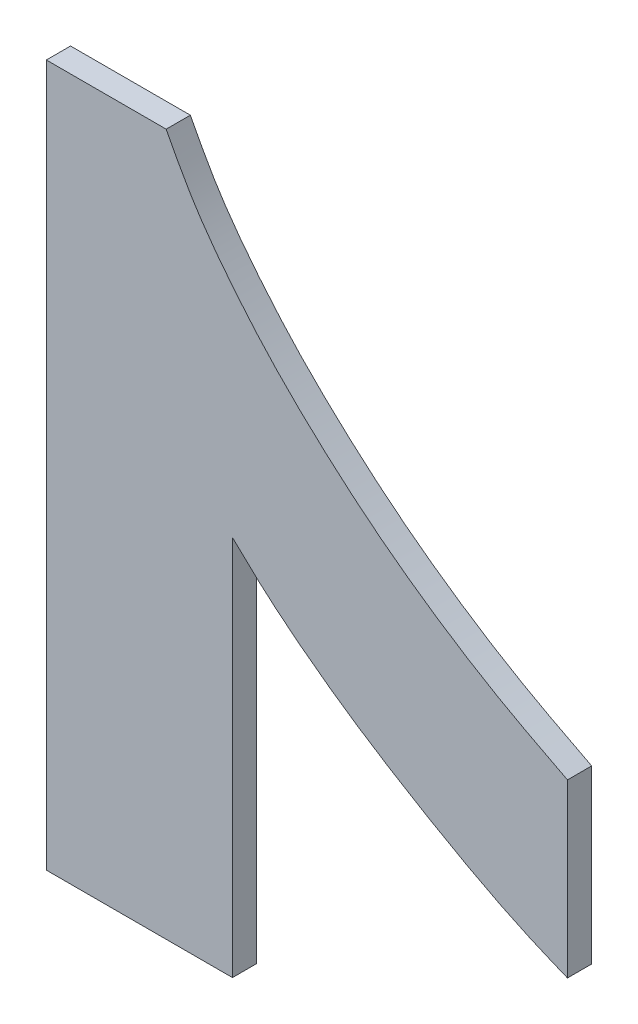
ISO-10303-21;
HEADER;
FILE_DESCRIPTION(('STEP AP214'),'2;1');
FILE_NAME('part.step','',(''),(''),'','','');
FILE_SCHEMA(('AUTOMOTIVE_DESIGN { 1 0 10303 214 1 1 1 1 }'));
ENDSEC;
DATA;
#1=APPLICATION_CONTEXT('core data for automotive mechanical design processes');
#2=APPLICATION_PROTOCOL_DEFINITION('international standard','automotive_design',2000,#1);
#3=PRODUCT_CONTEXT('',#1,'mechanical');
#4=PRODUCT('Part','Part','',(#3));
#5=PRODUCT_RELATED_PRODUCT_CATEGORY('part','',(#4));
#6=PRODUCT_DEFINITION_FORMATION('','',#4);
#7=PRODUCT_DEFINITION_CONTEXT('part definition',#1,'design');
#8=PRODUCT_DEFINITION('design','',#6,#7);
#9=PRODUCT_DEFINITION_SHAPE('','',#8);
#10=(LENGTH_UNIT() NAMED_UNIT(*) SI_UNIT(.MILLI.,.METRE.));
#11=(NAMED_UNIT(*) PLANE_ANGLE_UNIT() SI_UNIT($,.RADIAN.));
#12=(NAMED_UNIT(*) SI_UNIT($,.STERADIAN.) SOLID_ANGLE_UNIT());
#13=UNCERTAINTY_MEASURE_WITH_UNIT(LENGTH_MEASURE(1.E-05),#10,'distance_accuracy_value','');
#14=(GEOMETRIC_REPRESENTATION_CONTEXT(3) GLOBAL_UNCERTAINTY_ASSIGNED_CONTEXT((#13)) GLOBAL_UNIT_ASSIGNED_CONTEXT((#10,
#11,#12)) REPRESENTATION_CONTEXT('',''));
#15=CARTESIAN_POINT('',(0.,0.,0.));
#16=DIRECTION('',(0.,0.,1.));
#17=DIRECTION('',(1.,0.,0.));
#18=AXIS2_PLACEMENT_3D('',#15,#16,#17);
#19=CARTESIAN_POINT('',(-3.84615384615383,15.,0.5));
#20=DIRECTION('',(1.,0.,0.));
#21=DIRECTION('',(0.,0.,-1.));
#22=AXIS2_PLACEMENT_3D('',#19,#20,#21);
#23=PLANE('',#22);
#24=DIRECTION('',(0.,-1.,0.));
#25=VECTOR('',#24,1.);
#26=CARTESIAN_POINT('',(-3.84615384615383,15.,0.));
#27=LINE('',#26,#25);
#28=CARTESIAN_POINT('',(-3.84615384615383,15.,0.));
#29=VERTEX_POINT('',#28);
#30=CARTESIAN_POINT('',(-3.84615384615383,0.5,0.));
#31=VERTEX_POINT('',#30);
#32=EDGE_CURVE('E117',#29,#31,#27,.T.);
#33=ORIENTED_EDGE('',*,*,#32,.T.);
#34=DIRECTION('',(0.,0.,1.));
#35=VECTOR('',#34,1.);
#36=CARTESIAN_POINT('',(-3.84615384615383,0.5,0.5));
#37=LINE('',#36,#35);
#38=CARTESIAN_POINT('',(-3.84615384615383,0.5,0.5));
#39=VERTEX_POINT('',#38);
#40=EDGE_CURVE('E53',#31,#39,#37,.T.);
#41=ORIENTED_EDGE('',*,*,#40,.T.);
#42=DIRECTION('',(0.,-1.,0.));
#43=VECTOR('',#42,1.);
#44=CARTESIAN_POINT('',(-3.84615384615383,15.,0.5));
#45=LINE('',#44,#43);
#46=CARTESIAN_POINT('',(-3.84615384615383,15.,0.5));
#47=VERTEX_POINT('',#46);
#48=EDGE_CURVE('E108',#47,#39,#45,.T.);
#49=ORIENTED_EDGE('',*,*,#48,.F.);
#50=DIRECTION('',(0.,0.,-1.));
#51=VECTOR('',#50,1.);
#52=CARTESIAN_POINT('',(-3.84615384615383,15.,0.5));
#53=LINE('',#52,#51);
#54=EDGE_CURVE('E103',#47,#29,#53,.T.);
#55=ORIENTED_EDGE('',*,*,#54,.T.);
#56=EDGE_LOOP('',(#33,#41,#49,#55));
#57=FACE_BOUND('',#56,.T.);
#58=ADVANCED_FACE('F39',(#57),#23,.F.);
#59=CARTESIAN_POINT('',(0.,-15.,0.5));
#60=DIRECTION('',(-1.,0.,0.));
#61=DIRECTION('',(0.,0.,1.));
#62=AXIS2_PLACEMENT_3D('',#59,#60,#61);
#63=PLANE('',#62);
#64=DIRECTION('',(0.,1.,0.));
#65=VECTOR('',#64,1.);
#66=CARTESIAN_POINT('',(0.,-15.,0.5));
#67=LINE('',#66,#65);
#68=CARTESIAN_POINT('',(0.,0.499999999999997,0.5));
#69=VERTEX_POINT('',#68);
#70=CARTESIAN_POINT('',(0.,8.37740384615384,0.5));
#71=VERTEX_POINT('',#70);
#72=EDGE_CURVE('E101',#69,#71,#67,.T.);
#73=ORIENTED_EDGE('',*,*,#72,.F.);
#74=DIRECTION('',(0.,0.,-1.));
#75=VECTOR('',#74,1.);
#76=CARTESIAN_POINT('',(0.,0.5,0.5));
#77=LINE('',#76,#75);
#78=CARTESIAN_POINT('',(0.,0.5,0.));
#79=VERTEX_POINT('',#78);
#80=EDGE_CURVE('E91',#69,#79,#77,.T.);
#81=ORIENTED_EDGE('',*,*,#80,.T.);
#82=DIRECTION('',(0.,1.,0.));
#83=VECTOR('',#82,1.);
#84=CARTESIAN_POINT('',(0.,-15.,0.));
#85=LINE('',#84,#83);
#86=CARTESIAN_POINT('',(0.,8.37740384615384,0.));
#87=VERTEX_POINT('',#86);
#88=EDGE_CURVE('E105',#79,#87,#85,.T.);
#89=ORIENTED_EDGE('',*,*,#88,.T.);
#90=DIRECTION('',(0.,0.,-1.));
#91=VECTOR('',#90,1.);
#92=CARTESIAN_POINT('',(0.,8.37740384615384,0.5));
#93=LINE('',#92,#91);
#94=EDGE_CURVE('E358',#71,#87,#93,.T.);
#95=ORIENTED_EDGE('',*,*,#94,.F.);
#96=EDGE_LOOP('',(#73,#81,#89,#95));
#97=FACE_BOUND('',#96,.T.);
#98=ADVANCED_FACE('F99',(#97),#63,.F.);
#99=CARTESIAN_POINT('',(3.26330198461052,5.85851248596221,0.5));
#100=DIRECTION('',(0.,0.,-1.));
#101=DIRECTION('',(-1.,0.,0.));
#102=AXIS2_PLACEMENT_3D('',#99,#100,#101);
#103=PLANE('',#102);
#104=ORIENTED_EDGE('',*,*,#48,.T.);
#105=DIRECTION('',(1.,0.,0.));
#106=VECTOR('',#105,1.);
#107=CARTESIAN_POINT('',(3.26330198461052,0.5,0.5));
#108=LINE('',#107,#106);
#109=EDGE_CURVE('E111',#39,#69,#108,.T.);
#110=ORIENTED_EDGE('',*,*,#109,.T.);
#111=ORIENTED_EDGE('',*,*,#72,.T.);
#112=CARTESIAN_POINT('',(0.,8.37740384615384,0.5));
#113=CARTESIAN_POINT('',(0.221461878749049,8.16383111101191,0.5));
#114=CARTESIAN_POINT('',(0.681746123807014,7.71994358637309,0.5));
#115=CARTESIAN_POINT('',(1.45980801498442,7.09173189610138,0.5));
#116=CARTESIAN_POINT('',(2.32822452083274,6.45501271909084,0.5));
#117=CARTESIAN_POINT('',(3.27571870044587,5.84273604838447,0.5));
#118=CARTESIAN_POINT('',(4.24152873095678,5.26634359159262,0.5));
#119=CARTESIAN_POINT('',(5.17485978081582,4.74796719190857,0.5));
#120=CARTESIAN_POINT('',(6.06012949063285,4.30929498495674,0.5));
#121=CARTESIAN_POINT('',(6.6432614298942,4.069427286743,0.5));
#122=CARTESIAN_POINT('',(6.92307692307694,3.95432692307692,0.5));
#123=B_SPLINE_CURVE_WITH_KNOTS('',3,(#112,#113,#114,#115,#116,#117,#118,#119,#120,#121,#122),
.UNSPECIFIED.,.F.,.F.,(4,1,1,1,1,1,1,1,4),(0.,0.111670300101587,0.232094480856018,
0.362743459104553,0.502557509710885,0.641525103331281,0.771098495299668,0.890161757373253,1.),.UNSPECIFIED.);
#124=CARTESIAN_POINT('',(6.92307692307694,3.95432692307692,0.5));
#125=VERTEX_POINT('',#124);
#126=EDGE_CURVE('E121',#71,#125,#123,.T.);
#127=ORIENTED_EDGE('',*,*,#126,.T.);
#128=DIRECTION('',(0.,1.,0.));
#129=VECTOR('',#128,1.);
#130=CARTESIAN_POINT('',(6.92307692307694,3.95432692307692,0.5));
#131=LINE('',#130,#129);
#132=CARTESIAN_POINT('',(6.92307692307694,7.5,0.5));
#133=VERTEX_POINT('',#132);
#134=EDGE_CURVE('E127',#125,#133,#131,.T.);
#135=ORIENTED_EDGE('',*,*,#134,.T.);
#136=CARTESIAN_POINT('',(6.92307692307694,7.5,0.5));
#137=CARTESIAN_POINT('',(6.442464896918,7.74751615567842,0.5));
#138=CARTESIAN_POINT('',(5.49520705204643,8.23535584223946,0.5));
#139=CARTESIAN_POINT('',(4.15693655137856,9.07792204430808,0.5));
#140=CARTESIAN_POINT('',(2.9075170795154,9.99129849222041,0.5));
#141=CARTESIAN_POINT('',(1.76763147520342,10.9752829641881,0.5));
#142=CARTESIAN_POINT('',(0.745796665948821,11.9810917316379,0.5));
#143=CARTESIAN_POINT('',(-0.115318366653793,12.995992285635,0.5));
#144=CARTESIAN_POINT('',(-0.835844629758691,13.9827827559656,0.5));
#145=CARTESIAN_POINT('',(-1.19734630567233,14.6709596746129,0.5));
#146=CARTESIAN_POINT('',(-1.37019230769229,15.,0.5));
#147=B_SPLINE_CURVE_WITH_KNOTS('',3,(#136,#137,#138,#139,#140,#141,#142,#143,#144,#145,#146),
.UNSPECIFIED.,.F.,.F.,(4,1,1,1,1,1,1,1,4),(0.,0.142657250700614,0.281168993905444,
0.416977192367974,0.550852492747558,0.678364170261812,0.795032443007095,0.901998178347352,1.),.UNSPECIFIED.);
#148=CARTESIAN_POINT('',(-1.37019230769229,15.,0.5));
#149=VERTEX_POINT('',#148);
#150=EDGE_CURVE('E133',#133,#149,#147,.T.);
#151=ORIENTED_EDGE('',*,*,#150,.T.);
#152=DIRECTION('',(-1.,0.,0.));
#153=VECTOR('',#152,1.);
#154=CARTESIAN_POINT('',(-1.37019230769229,15.,0.5));
#155=LINE('',#154,#153);
#156=EDGE_CURVE('E136',#149,#47,#155,.T.);
#157=ORIENTED_EDGE('',*,*,#156,.T.);
#158=EDGE_LOOP('',(#104,#110,#111,#127,#135,#151,#157));
#159=FACE_BOUND('',#158,.T.);
#160=ADVANCED_FACE('F158',(#159),#103,.F.);
#161=DIRECTION('',(0.,0.,-1.));
#162=VECTOR('',#161,1.);
#163=SURFACE_OF_LINEAR_EXTRUSION('',#123,#162);
#164=CARTESIAN_POINT('',(0.,8.37740384615384,0.));
#165=CARTESIAN_POINT('',(0.221461878749049,8.16383111101191,0.));
#166=CARTESIAN_POINT('',(0.681746123807014,7.71994358637309,0.));
#167=CARTESIAN_POINT('',(1.45980801498442,7.09173189610138,0.));
#168=CARTESIAN_POINT('',(2.32822452083274,6.45501271909084,0.));
#169=CARTESIAN_POINT('',(3.27571870044587,5.84273604838447,0.));
#170=CARTESIAN_POINT('',(4.24152873095678,5.26634359159262,0.));
#171=CARTESIAN_POINT('',(5.17485978081582,4.74796719190857,0.));
#172=CARTESIAN_POINT('',(6.06012949063285,4.30929498495674,0.));
#173=CARTESIAN_POINT('',(6.6432614298942,4.069427286743,0.));
#174=CARTESIAN_POINT('',(6.92307692307694,3.95432692307692,0.));
#175=B_SPLINE_CURVE_WITH_KNOTS('',3,(#164,#165,#166,#167,#168,#169,#170,#171,#172,#173,#174),
.UNSPECIFIED.,.F.,.F.,(4,1,1,1,1,1,1,1,4),(0.,0.111670300101587,0.232094480856018,
0.362743459104553,0.502557509710885,0.641525103331281,0.771098495299668,0.890161757373253,1.),.UNSPECIFIED.);
#176=CARTESIAN_POINT('',(6.92307692307694,3.95432692307692,0.));
#177=VERTEX_POINT('',#176);
#178=EDGE_CURVE('E106',#87,#177,#175,.T.);
#179=ORIENTED_EDGE('',*,*,#178,.T.);
#180=DIRECTION('',(0.,0.,-1.));
#181=VECTOR('',#180,1.);
#182=CARTESIAN_POINT('',(6.92307692307694,3.95432692307692,0.5));
#183=LINE('',#182,#181);
#184=EDGE_CURVE('E356',#125,#177,#183,.T.);
#185=ORIENTED_EDGE('',*,*,#184,.F.);
#186=ORIENTED_EDGE('',*,*,#126,.F.);
#187=ORIENTED_EDGE('',*,*,#94,.T.);
#188=EDGE_LOOP('',(#179,#185,#186,#187));
#189=FACE_BOUND('',#188,.T.);
#190=ADVANCED_FACE('F165',(#189),#163,.F.);
#191=CARTESIAN_POINT('',(6.92307692307694,3.95432692307692,0.5));
#192=DIRECTION('',(-1.,0.,0.));
#193=DIRECTION('',(0.,0.,1.));
#194=AXIS2_PLACEMENT_3D('',#191,#192,#193);
#195=PLANE('',#194);
#196=DIRECTION('',(0.,1.,0.));
#197=VECTOR('',#196,1.);
#198=CARTESIAN_POINT('',(6.92307692307694,3.95432692307692,0.));
#199=LINE('',#198,#197);
#200=CARTESIAN_POINT('',(6.92307692307694,7.5,0.));
#201=VERTEX_POINT('',#200);
#202=EDGE_CURVE('E355',#177,#201,#199,.T.);
#203=ORIENTED_EDGE('',*,*,#202,.T.);
#204=DIRECTION('',(0.,0.,-1.));
#205=VECTOR('',#204,1.);
#206=CARTESIAN_POINT('',(6.92307692307694,7.5,0.5));
#207=LINE('',#206,#205);
#208=EDGE_CURVE('E354',#133,#201,#207,.T.);
#209=ORIENTED_EDGE('',*,*,#208,.F.);
#210=ORIENTED_EDGE('',*,*,#134,.F.);
#211=ORIENTED_EDGE('',*,*,#184,.T.);
#212=EDGE_LOOP('',(#203,#209,#210,#211));
#213=FACE_BOUND('',#212,.T.);
#214=ADVANCED_FACE('F154',(#213),#195,.F.);
#215=DIRECTION('',(0.,0.,-1.));
#216=VECTOR('',#215,1.);
#217=SURFACE_OF_LINEAR_EXTRUSION('',#147,#216);
#218=CARTESIAN_POINT('',(6.92307692307694,7.5,0.));
#219=CARTESIAN_POINT('',(6.442464896918,7.74751615567842,0.));
#220=CARTESIAN_POINT('',(5.49520705204643,8.23535584223946,0.));
#221=CARTESIAN_POINT('',(4.15693655137856,9.07792204430808,0.));
#222=CARTESIAN_POINT('',(2.9075170795154,9.99129849222041,0.));
#223=CARTESIAN_POINT('',(1.76763147520342,10.9752829641881,0.));
#224=CARTESIAN_POINT('',(0.745796665948821,11.9810917316379,0.));
#225=CARTESIAN_POINT('',(-0.115318366653793,12.995992285635,0.));
#226=CARTESIAN_POINT('',(-0.835844629758691,13.9827827559656,0.));
#227=CARTESIAN_POINT('',(-1.19734630567233,14.6709596746129,0.));
#228=CARTESIAN_POINT('',(-1.37019230769229,15.,0.));
#229=B_SPLINE_CURVE_WITH_KNOTS('',3,(#218,#219,#220,#221,#222,#223,#224,#225,#226,#227,#228),
.UNSPECIFIED.,.F.,.F.,(4,1,1,1,1,1,1,1,4),(0.,0.142657250700614,0.281168993905444,
0.416977192367974,0.550852492747558,0.678364170261812,0.795032443007095,0.901998178347352,1.),.UNSPECIFIED.);
#230=CARTESIAN_POINT('',(-1.37019230769229,15.,0.));
#231=VERTEX_POINT('',#230);
#232=EDGE_CURVE('E361',#201,#231,#229,.T.);
#233=ORIENTED_EDGE('',*,*,#232,.T.);
#234=DIRECTION('',(0.,0.,-1.));
#235=VECTOR('',#234,1.);
#236=CARTESIAN_POINT('',(-1.37019230769229,15.,0.5));
#237=LINE('',#236,#235);
#238=EDGE_CURVE('E48',#149,#231,#237,.T.);
#239=ORIENTED_EDGE('',*,*,#238,.F.);
#240=ORIENTED_EDGE('',*,*,#150,.F.);
#241=ORIENTED_EDGE('',*,*,#208,.T.);
#242=EDGE_LOOP('',(#233,#239,#240,#241));
#243=FACE_BOUND('',#242,.T.);
#244=ADVANCED_FACE('F150',(#243),#217,.F.);
#245=CARTESIAN_POINT('',(-1.37019230769229,15.,0.5));
#246=DIRECTION('',(0.,-1.,0.));
#247=DIRECTION('',(0.,0.,-1.));
#248=AXIS2_PLACEMENT_3D('',#245,#246,#247);
#249=PLANE('',#248);
#250=DIRECTION('',(-1.,0.,0.));
#251=VECTOR('',#250,1.);
#252=CARTESIAN_POINT('',(-1.37019230769229,15.,0.));
#253=LINE('',#252,#251);
#254=EDGE_CURVE('E363',#231,#29,#253,.T.);
#255=ORIENTED_EDGE('',*,*,#254,.T.);
#256=ORIENTED_EDGE('',*,*,#54,.F.);
#257=ORIENTED_EDGE('',*,*,#156,.F.);
#258=ORIENTED_EDGE('',*,*,#238,.T.);
#259=EDGE_LOOP('',(#255,#256,#257,#258));
#260=FACE_BOUND('',#259,.T.);
#261=ADVANCED_FACE('F152',(#260),#249,.F.);
#262=CARTESIAN_POINT('',(3.26330198461052,5.85851248596221,0.));
#263=DIRECTION('',(0.,0.,-1.));
#264=DIRECTION('',(-1.,0.,0.));
#265=AXIS2_PLACEMENT_3D('',#262,#263,#264);
#266=PLANE('',#265);
#267=DIRECTION('',(1.,0.,0.));
#268=VECTOR('',#267,1.);
#269=CARTESIAN_POINT('',(3.26330198461052,0.5,0.));
#270=LINE('',#269,#268);
#271=EDGE_CURVE('E11',#31,#79,#270,.T.);
#272=ORIENTED_EDGE('',*,*,#271,.F.);
#273=ORIENTED_EDGE('',*,*,#32,.F.);
#274=ORIENTED_EDGE('',*,*,#254,.F.);
#275=ORIENTED_EDGE('',*,*,#232,.F.);
#276=ORIENTED_EDGE('',*,*,#202,.F.);
#277=ORIENTED_EDGE('',*,*,#178,.F.);
#278=ORIENTED_EDGE('',*,*,#88,.F.);
#279=EDGE_LOOP('',(#272,#273,#274,#275,#276,#277,#278));
#280=FACE_BOUND('',#279,.T.);
#281=ADVANCED_FACE('F41',(#280),#266,.T.);
#282=CARTESIAN_POINT('',(-17.,0.5,1.));
#283=DIRECTION('',(0.,1.,0.));
#284=DIRECTION('',(0.,0.,1.));
#285=AXIS2_PLACEMENT_3D('',#282,#283,#284);
#286=PLANE('',#285);
#287=ORIENTED_EDGE('',*,*,#271,.T.);
#288=ORIENTED_EDGE('',*,*,#80,.F.);
#289=ORIENTED_EDGE('',*,*,#109,.F.);
#290=ORIENTED_EDGE('',*,*,#40,.F.);
#291=EDGE_LOOP('',(#287,#288,#289,#290));
#292=FACE_BOUND('',#291,.T.);
#293=ADVANCED_FACE('F93',(#292),#286,.F.);
#294=CLOSED_SHELL('',(#58,#98,#160,#190,#214,#244,#261,#281,#293));
#295=MANIFOLD_SOLID_BREP('B2',#294);
#296=ADVANCED_BREP_SHAPE_REPRESENTATION('',(#18,#295),#14);
#297=SHAPE_DEFINITION_REPRESENTATION(#9,#296);
ENDSEC;
END-ISO-10303-21;
